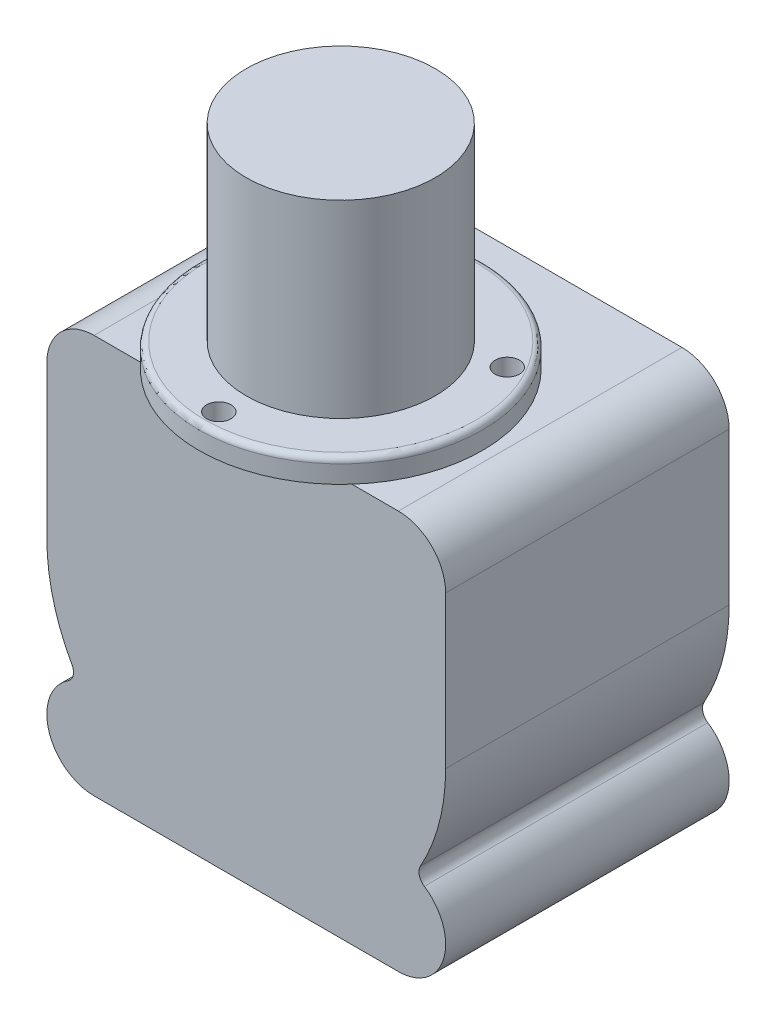
ISO-10303-21;
HEADER;
FILE_DESCRIPTION(('STEP AP214'),'2;1');
FILE_NAME('part.step','',(''),(''),'','','');
FILE_SCHEMA(('AUTOMOTIVE_DESIGN { 1 0 10303 214 1 1 1 1 }'));
ENDSEC;
DATA;
#1=APPLICATION_CONTEXT('core data for automotive mechanical design processes');
#2=APPLICATION_PROTOCOL_DEFINITION('international standard','automotive_design',2000,#1);
#3=PRODUCT_CONTEXT('',#1,'mechanical');
#4=PRODUCT('Part','Part','',(#3));
#5=PRODUCT_RELATED_PRODUCT_CATEGORY('part','',(#4));
#6=PRODUCT_DEFINITION_FORMATION('','',#4);
#7=PRODUCT_DEFINITION_CONTEXT('part definition',#1,'design');
#8=PRODUCT_DEFINITION('design','',#6,#7);
#9=PRODUCT_DEFINITION_SHAPE('','',#8);
#10=(LENGTH_UNIT() NAMED_UNIT(*) SI_UNIT(.MILLI.,.METRE.));
#11=(NAMED_UNIT(*) PLANE_ANGLE_UNIT() SI_UNIT($,.RADIAN.));
#12=(NAMED_UNIT(*) SI_UNIT($,.STERADIAN.) SOLID_ANGLE_UNIT());
#13=UNCERTAINTY_MEASURE_WITH_UNIT(LENGTH_MEASURE(1.E-05),#10,'distance_accuracy_value','');
#14=(GEOMETRIC_REPRESENTATION_CONTEXT(3) GLOBAL_UNCERTAINTY_ASSIGNED_CONTEXT((#13)) GLOBAL_UNIT_ASSIGNED_CONTEXT((#10,
#11,#12)) REPRESENTATION_CONTEXT('',''));
#15=CARTESIAN_POINT('',(0.,0.,0.));
#16=DIRECTION('',(0.,0.,1.));
#17=DIRECTION('',(1.,0.,0.));
#18=AXIS2_PLACEMENT_3D('',#15,#16,#17);
#19=CARTESIAN_POINT('',(-14.1880941902005,23.6220000000458,17.2085));
#20=DIRECTION('',(0.,1.,0.));
#21=DIRECTION('',(0.,0.,1.));
#22=AXIS2_PLACEMENT_3D('',#19,#20,#21);
#23=CONICAL_SURFACE('',#22,1.63830000012158,1.02974425869284);
#24=CARTESIAN_POINT('',(-14.1880941902173,22.637610047866,17.2085));
#25=VERTEX_POINT('',#24);
#26=VERTEX_LOOP('',#25);
#27=FACE_BOUND('',#26,.T.);
#28=CARTESIAN_POINT('',(-14.1880941902005,23.622,17.2085));
#29=DIRECTION('',(0.,1.,0.));
#30=DIRECTION('',(0.,0.,1.));
#31=AXIS2_PLACEMENT_3D('',#28,#29,#30);
#32=CIRCLE('',#31,1.6383);
#33=CARTESIAN_POINT('',(-14.1880941902005,23.622,18.8468));
#34=VERTEX_POINT('',#33);
#35=EDGE_CURVE('E189',#34,#34,#32,.T.);
#36=ORIENTED_EDGE('',*,*,#35,.T.);
#37=EDGE_LOOP('',(#36));
#38=FACE_BOUND('',#37,.T.);
#39=ADVANCED_FACE('F17',(#27,#38),#23,.F.);
#40=CARTESIAN_POINT('',(14.1880941902005,23.6220000000458,17.2085));
#41=DIRECTION('',(0.,1.,0.));
#42=DIRECTION('',(0.,0.,1.));
#43=AXIS2_PLACEMENT_3D('',#40,#41,#42);
#44=CONICAL_SURFACE('',#43,1.63829999998452,1.02974425864961);
#45=CARTESIAN_POINT('',(14.1880941901604,22.637610047866,17.2085));
#46=VERTEX_POINT('',#45);
#47=VERTEX_LOOP('',#46);
#48=FACE_BOUND('',#47,.T.);
#49=CARTESIAN_POINT('',(14.1880941902005,23.622,17.2085));
#50=DIRECTION('',(0.,1.,0.));
#51=DIRECTION('',(0.,0.,1.));
#52=AXIS2_PLACEMENT_3D('',#49,#50,#51);
#53=CIRCLE('',#52,1.6383);
#54=CARTESIAN_POINT('',(14.1880941902005,23.622,18.8468));
#55=VERTEX_POINT('',#54);
#56=EDGE_CURVE('E181',#55,#55,#53,.T.);
#57=ORIENTED_EDGE('',*,*,#56,.T.);
#58=EDGE_LOOP('',(#57));
#59=FACE_BOUND('',#58,.T.);
#60=ADVANCED_FACE('F264',(#48,#59),#44,.F.);
#61=CARTESIAN_POINT('',(0.,55.372,25.4));
#62=DIRECTION('',(0.,-1.,0.));
#63=DIRECTION('',(0.,0.,-1.));
#64=AXIS2_PLACEMENT_3D('',#61,#62,#63);
#65=PLANE('',#64);
#66=CARTESIAN_POINT('',(0.,55.372,25.4));
#67=DIRECTION('',(0.,1.,0.));
#68=DIRECTION('',(0.,0.,1.));
#69=AXIS2_PLACEMENT_3D('',#66,#67,#68);
#70=CIRCLE('',#69,12.7);
#71=CARTESIAN_POINT('',(0.,55.372,38.1));
#72=VERTEX_POINT('',#71);
#73=EDGE_CURVE('E20',#72,#72,#70,.F.);
#74=ORIENTED_EDGE('',*,*,#73,.F.);
#75=EDGE_LOOP('',(#74));
#76=FACE_BOUND('',#75,.T.);
#77=ADVANCED_FACE('F261',(#76),#65,.F.);
#78=CARTESIAN_POINT('',(-14.1880941902005,26.797,17.2085));
#79=DIRECTION('',(0.,1.,0.));
#80=DIRECTION('',(0.,0.,1.));
#81=AXIS2_PLACEMENT_3D('',#78,#79,#80);
#82=CYLINDRICAL_SURFACE('',#81,1.6383);
#83=ORIENTED_EDGE('',*,*,#35,.F.);
#84=EDGE_LOOP('',(#83));
#85=FACE_BOUND('',#84,.T.);
#86=CARTESIAN_POINT('',(-14.1880941902005,29.972,17.2085));
#87=DIRECTION('',(0.,1.,0.));
#88=DIRECTION('',(0.,0.,1.));
#89=AXIS2_PLACEMENT_3D('',#86,#87,#88);
#90=CIRCLE('',#89,1.6383);
#91=CARTESIAN_POINT('',(-14.1880941902005,29.972,18.8468));
#92=VERTEX_POINT('',#91);
#93=EDGE_CURVE('E252',#92,#92,#90,.T.);
#94=ORIENTED_EDGE('',*,*,#93,.T.);
#95=EDGE_LOOP('',(#94));
#96=FACE_BOUND('',#95,.T.);
#97=ADVANCED_FACE('F263',(#85,#96),#82,.F.);
#98=CARTESIAN_POINT('',(14.1880941902005,26.797,17.2085));
#99=DIRECTION('',(0.,1.,0.));
#100=DIRECTION('',(0.,0.,1.));
#101=AXIS2_PLACEMENT_3D('',#98,#99,#100);
#102=CYLINDRICAL_SURFACE('',#101,1.6383);
#103=ORIENTED_EDGE('',*,*,#56,.F.);
#104=EDGE_LOOP('',(#103));
#105=FACE_BOUND('',#104,.T.);
#106=CARTESIAN_POINT('',(14.1880941902005,29.972,17.2085));
#107=DIRECTION('',(0.,1.,0.));
#108=DIRECTION('',(0.,0.,1.));
#109=AXIS2_PLACEMENT_3D('',#106,#107,#108);
#110=CIRCLE('',#109,1.6383);
#111=CARTESIAN_POINT('',(14.1880941902005,29.972,18.8468));
#112=VERTEX_POINT('',#111);
#113=EDGE_CURVE('E250',#112,#112,#110,.T.);
#114=ORIENTED_EDGE('',*,*,#113,.T.);
#115=EDGE_LOOP('',(#114));
#116=FACE_BOUND('',#115,.T.);
#117=ADVANCED_FACE('F271',(#105,#116),#102,.F.);
#118=CARTESIAN_POINT('',(0.,29.972,25.4));
#119=DIRECTION('',(0.,1.,0.));
#120=DIRECTION('',(0.,0.,1.));
#121=AXIS2_PLACEMENT_3D('',#118,#119,#120);
#122=CYLINDRICAL_SURFACE('',#121,12.7);
#123=CARTESIAN_POINT('',(0.,29.972,25.4));
#124=DIRECTION('',(0.,1.,0.));
#125=DIRECTION('',(0.,0.,1.));
#126=AXIS2_PLACEMENT_3D('',#123,#124,#125);
#127=CIRCLE('',#126,12.7);
#128=CARTESIAN_POINT('',(0.,29.972,38.1));
#129=VERTEX_POINT('',#128);
#130=EDGE_CURVE('E247',#129,#129,#127,.T.);
#131=ORIENTED_EDGE('',*,*,#130,.T.);
#132=EDGE_LOOP('',(#131));
#133=FACE_BOUND('',#132,.T.);
#134=ORIENTED_EDGE('',*,*,#73,.T.);
#135=EDGE_LOOP('',(#134));
#136=FACE_BOUND('',#135,.T.);
#137=ADVANCED_FACE('F259',(#133,#136),#122,.T.);
#138=CARTESIAN_POINT('',(0.,29.972,25.4));
#139=DIRECTION('',(0.,-1.,0.));
#140=DIRECTION('',(0.,0.,-1.));
#141=AXIS2_PLACEMENT_3D('',#138,#139,#140);
#142=PLANE('',#141);
#143=ORIENTED_EDGE('',*,*,#130,.F.);
#144=EDGE_LOOP('',(#143));
#145=FACE_BOUND('',#144,.T.);
#146=CARTESIAN_POINT('',(0.,29.972,41.783));
#147=DIRECTION('',(0.,1.,0.));
#148=DIRECTION('',(0.,0.,1.));
#149=AXIS2_PLACEMENT_3D('',#146,#147,#148);
#150=CIRCLE('',#149,1.6383);
#151=CARTESIAN_POINT('',(0.,29.972,43.4213));
#152=VERTEX_POINT('',#151);
#153=EDGE_CURVE('E152',#152,#152,#150,.F.);
#154=ORIENTED_EDGE('',*,*,#153,.T.);
#155=EDGE_LOOP('',(#154));
#156=FACE_BOUND('',#155,.T.);
#157=ORIENTED_EDGE('',*,*,#113,.F.);
#158=EDGE_LOOP('',(#157));
#159=FACE_BOUND('',#158,.T.);
#160=ORIENTED_EDGE('',*,*,#93,.F.);
#161=EDGE_LOOP('',(#160));
#162=FACE_BOUND('',#161,.T.);
#163=CARTESIAN_POINT('',(0.,29.972,25.4));
#164=DIRECTION('',(0.,-1.,0.));
#165=DIRECTION('',(1.,0.,0.));
#166=AXIS2_PLACEMENT_3D('',#163,#164,#165);
#167=CIRCLE('',#166,18.25625);
#168=CARTESIAN_POINT('',(18.25625,29.972,25.4));
#169=VERTEX_POINT('',#168);
#170=EDGE_CURVE('E246',#169,#169,#167,.T.);
#171=ORIENTED_EDGE('',*,*,#170,.F.);
#172=EDGE_LOOP('',(#171));
#173=FACE_BOUND('',#172,.T.);
#174=ADVANCED_FACE('F170',(#145,#156,#159,#162,#173),#142,.F.);
#175=CARTESIAN_POINT('',(0.,29.17825,25.4));
#176=DIRECTION('',(0.,-1.,0.));
#177=DIRECTION('',(0.,0.,-1.));
#178=AXIS2_PLACEMENT_3D('',#175,#176,#177);
#179=TOROIDAL_SURFACE('',#178,18.25625,0.79375);
#180=CARTESIAN_POINT('',(0.,29.17825,25.4));
#181=DIRECTION('',(0.,1.,0.));
#182=DIRECTION('',(0.,0.,1.));
#183=AXIS2_PLACEMENT_3D('',#180,#181,#182);
#184=CIRCLE('',#183,19.05);
#185=CARTESIAN_POINT('',(0.,29.17825,44.45));
#186=VERTEX_POINT('',#185);
#187=EDGE_CURVE('E123',#186,#186,#184,.F.);
#188=ORIENTED_EDGE('',*,*,#187,.F.);
#189=EDGE_LOOP('',(#188));
#190=FACE_BOUND('',#189,.T.);
#191=ORIENTED_EDGE('',*,*,#170,.T.);
#192=EDGE_LOOP('',(#191));
#193=FACE_BOUND('',#192,.T.);
#194=ADVANCED_FACE('F164',(#190,#193),#179,.T.);
#195=CARTESIAN_POINT('',(0.,26.797,41.783));
#196=DIRECTION('',(0.,1.,0.));
#197=DIRECTION('',(0.,0.,1.));
#198=AXIS2_PLACEMENT_3D('',#195,#196,#197);
#199=CYLINDRICAL_SURFACE('',#198,1.6383);
#200=ORIENTED_EDGE('',*,*,#153,.F.);
#201=EDGE_LOOP('',(#200));
#202=FACE_BOUND('',#201,.T.);
#203=CARTESIAN_POINT('',(0.,26.797,41.783));
#204=DIRECTION('',(0.,1.,0.));
#205=DIRECTION('',(0.,0.,1.));
#206=AXIS2_PLACEMENT_3D('',#203,#204,#205);
#207=CIRCLE('',#206,1.6383);
#208=CARTESIAN_POINT('',(0.,26.797,43.4213));
#209=VERTEX_POINT('',#208);
#210=EDGE_CURVE('E232',#209,#209,#207,.T.);
#211=ORIENTED_EDGE('',*,*,#210,.F.);
#212=EDGE_LOOP('',(#211));
#213=FACE_BOUND('',#212,.T.);
#214=ADVANCED_FACE('F169',(#202,#213),#199,.F.);
#215=CARTESIAN_POINT('',(0.,26.797,25.4));
#216=DIRECTION('',(0.,1.,0.));
#217=DIRECTION('',(0.,0.,1.));
#218=AXIS2_PLACEMENT_3D('',#215,#216,#217);
#219=CYLINDRICAL_SURFACE('',#218,19.05);
#220=ORIENTED_EDGE('',*,*,#187,.T.);
#221=EDGE_LOOP('',(#220));
#222=FACE_BOUND('',#221,.T.);
#223=CARTESIAN_POINT('',(0.,26.797,25.4));
#224=DIRECTION('',(0.,1.,0.));
#225=DIRECTION('',(0.,0.,1.));
#226=AXIS2_PLACEMENT_3D('',#223,#224,#225);
#227=CIRCLE('',#226,19.05);
#228=CARTESIAN_POINT('',(-14.1990316571237,26.797,38.1));
#229=VERTEX_POINT('',#228);
#230=CARTESIAN_POINT('',(14.1990316571237,26.797,38.1));
#231=VERTEX_POINT('',#230);
#232=EDGE_CURVE('E229',#229,#231,#227,.F.);
#233=ORIENTED_EDGE('',*,*,#232,.F.);
#234=CARTESIAN_POINT('',(0.,26.797,25.4));
#235=DIRECTION('',(0.,1.,0.));
#236=DIRECTION('',(0.,0.,1.));
#237=AXIS2_PLACEMENT_3D('',#234,#235,#236);
#238=CIRCLE('',#237,19.05);
#239=EDGE_CURVE('E235',#231,#229,#238,.F.);
#240=ORIENTED_EDGE('',*,*,#239,.F.);
#241=EDGE_LOOP('',(#233,#240));
#242=FACE_BOUND('',#241,.T.);
#243=ADVANCED_FACE('F330',(#222,#242),#219,.T.);
#244=CARTESIAN_POINT('',(0.,0.,0.));
#245=DIRECTION('',(0.,0.,1.));
#246=DIRECTION('',(1.,0.,0.));
#247=AXIS2_PLACEMENT_3D('',#244,#245,#246);
#248=PLANE('',#247);
#249=DIRECTION('',(1.,0.,0.));
#250=VECTOR('',#249,1.);
#251=CARTESIAN_POINT('',(26.797,-26.797,0.));
#252=LINE('',#251,#250);
#253=CARTESIAN_POINT('',(-20.447,-26.797,0.));
#254=VERTEX_POINT('',#253);
#255=CARTESIAN_POINT('',(20.447,-26.797,0.));
#256=VERTEX_POINT('',#255);
#257=EDGE_CURVE('E118',#254,#256,#252,.T.);
#258=ORIENTED_EDGE('',*,*,#257,.F.);
#259=CARTESIAN_POINT('',(-20.447,-20.447,0.));
#260=DIRECTION('',(0.,0.,-1.));
#261=DIRECTION('',(-1.,0.,0.));
#262=AXIS2_PLACEMENT_3D('',#259,#260,#261);
#263=CIRCLE('',#262,6.35);
#264=CARTESIAN_POINT('',(-23.9286348770227,-15.1365651229773,0.));
#265=VERTEX_POINT('',#264);
#266=EDGE_CURVE('E131',#265,#254,#263,.F.);
#267=ORIENTED_EDGE('',*,*,#266,.F.);
#268=CARTESIAN_POINT('',(-24.7990435962784,-13.8089564037216,0.));
#269=DIRECTION('',(0.,0.,-1.));
#270=DIRECTION('',(-1.,0.,0.));
#271=AXIS2_PLACEMENT_3D('',#268,#269,#270);
#272=CIRCLE('',#271,1.5875);
#273=CARTESIAN_POINT('',(-23.4120724779183,-13.0366434057506,0.));
#274=VERTEX_POINT('',#273);
#275=EDGE_CURVE('E221',#265,#274,#272,.F.);
#276=ORIENTED_EDGE('',*,*,#275,.T.);
#277=CARTESIAN_POINT('',(0.,0.,0.));
#278=DIRECTION('',(0.,0.,-1.));
#279=DIRECTION('',(-1.,0.,0.));
#280=AXIS2_PLACEMENT_3D('',#277,#278,#279);
#281=CIRCLE('',#280,26.797);
#282=CARTESIAN_POINT('',(-26.797,0.,0.));
#283=VERTEX_POINT('',#282);
#284=EDGE_CURVE('E224',#283,#274,#281,.F.);
#285=ORIENTED_EDGE('',*,*,#284,.F.);
#286=DIRECTION('',(0.,1.,0.));
#287=VECTOR('',#286,1.);
#288=CARTESIAN_POINT('',(-26.797,-26.797,0.));
#289=LINE('',#288,#287);
#290=CARTESIAN_POINT('',(-26.797,20.447,0.));
#291=VERTEX_POINT('',#290);
#292=EDGE_CURVE('E142',#291,#283,#289,.F.);
#293=ORIENTED_EDGE('',*,*,#292,.F.);
#294=CARTESIAN_POINT('',(-20.447,20.447,0.));
#295=DIRECTION('',(0.,0.,1.));
#296=DIRECTION('',(1.,0.,0.));
#297=AXIS2_PLACEMENT_3D('',#294,#295,#296);
#298=CIRCLE('',#297,6.35);
#299=CARTESIAN_POINT('',(-20.447,26.797,0.));
#300=VERTEX_POINT('',#299);
#301=EDGE_CURVE('E227',#300,#291,#298,.T.);
#302=ORIENTED_EDGE('',*,*,#301,.F.);
#303=DIRECTION('',(1.,0.,0.));
#304=VECTOR('',#303,1.);
#305=CARTESIAN_POINT('',(-26.797,26.797,0.));
#306=LINE('',#305,#304);
#307=CARTESIAN_POINT('',(20.447,26.797,0.));
#308=VERTEX_POINT('',#307);
#309=EDGE_CURVE('E146',#308,#300,#306,.F.);
#310=ORIENTED_EDGE('',*,*,#309,.F.);
#311=CARTESIAN_POINT('',(20.447,20.447,0.));
#312=DIRECTION('',(0.,0.,1.));
#313=DIRECTION('',(1.,0.,0.));
#314=AXIS2_PLACEMENT_3D('',#311,#312,#313);
#315=CIRCLE('',#314,6.35);
#316=CARTESIAN_POINT('',(26.797,20.447,0.));
#317=VERTEX_POINT('',#316);
#318=EDGE_CURVE('E238',#317,#308,#315,.T.);
#319=ORIENTED_EDGE('',*,*,#318,.F.);
#320=DIRECTION('',(0.,1.,0.));
#321=VECTOR('',#320,1.);
#322=CARTESIAN_POINT('',(26.797,26.797,0.));
#323=LINE('',#322,#321);
#324=CARTESIAN_POINT('',(26.797,0.,0.));
#325=VERTEX_POINT('',#324);
#326=EDGE_CURVE('E155',#325,#317,#323,.T.);
#327=ORIENTED_EDGE('',*,*,#326,.F.);
#328=CARTESIAN_POINT('',(0.,0.,0.));
#329=DIRECTION('',(0.,0.,-1.));
#330=DIRECTION('',(-1.,0.,0.));
#331=AXIS2_PLACEMENT_3D('',#328,#329,#330);
#332=CIRCLE('',#331,26.797);
#333=CARTESIAN_POINT('',(23.4120724779183,-13.0366434057506,0.));
#334=VERTEX_POINT('',#333);
#335=EDGE_CURVE('E240',#334,#325,#332,.F.);
#336=ORIENTED_EDGE('',*,*,#335,.F.);
#337=CARTESIAN_POINT('',(24.7990435962784,-13.8089564037216,0.));
#338=DIRECTION('',(0.,0.,-1.));
#339=DIRECTION('',(-1.,0.,0.));
#340=AXIS2_PLACEMENT_3D('',#337,#338,#339);
#341=CIRCLE('',#340,1.5875);
#342=CARTESIAN_POINT('',(23.9286348770227,-15.1365651229773,0.));
#343=VERTEX_POINT('',#342);
#344=EDGE_CURVE('E120',#334,#343,#341,.F.);
#345=ORIENTED_EDGE('',*,*,#344,.T.);
#346=CARTESIAN_POINT('',(20.447,-20.447,0.));
#347=DIRECTION('',(0.,0.,-1.));
#348=DIRECTION('',(-1.,0.,0.));
#349=AXIS2_PLACEMENT_3D('',#346,#347,#348);
#350=CIRCLE('',#349,6.35);
#351=EDGE_CURVE('E113',#256,#343,#350,.F.);
#352=ORIENTED_EDGE('',*,*,#351,.F.);
#353=EDGE_LOOP('',(#258,#267,#276,#285,#293,#302,#310,#319,#327,#336,#345,#352));
#354=FACE_BOUND('',#353,.T.);
#355=ADVANCED_FACE('F115',(#354),#248,.F.);
#356=CARTESIAN_POINT('',(20.447,-20.447,38.1));
#357=DIRECTION('',(0.,0.,-1.));
#358=DIRECTION('',(-1.,0.,0.));
#359=AXIS2_PLACEMENT_3D('',#356,#357,#358);
#360=CYLINDRICAL_SURFACE('',#359,6.35);
#361=DIRECTION('',(0.,0.,-1.));
#362=VECTOR('',#361,1.);
#363=CARTESIAN_POINT('',(20.447,-26.797,0.));
#364=LINE('',#363,#362);
#365=CARTESIAN_POINT('',(20.447,-26.797,38.1));
#366=VERTEX_POINT('',#365);
#367=EDGE_CURVE('E126',#256,#366,#364,.F.);
#368=ORIENTED_EDGE('',*,*,#367,.F.);
#369=ORIENTED_EDGE('',*,*,#351,.T.);
#370=DIRECTION('',(0.,0.,-1.));
#371=VECTOR('',#370,1.);
#372=CARTESIAN_POINT('',(23.9286348770227,-15.1365651229773,38.1));
#373=LINE('',#372,#371);
#374=CARTESIAN_POINT('',(23.9286348770227,-15.1365651229773,38.1));
#375=VERTEX_POINT('',#374);
#376=EDGE_CURVE('E140',#343,#375,#373,.F.);
#377=ORIENTED_EDGE('',*,*,#376,.T.);
#378=CARTESIAN_POINT('',(20.447,-20.447,38.1));
#379=DIRECTION('',(0.,0.,-1.));
#380=DIRECTION('',(-1.,0.,0.));
#381=AXIS2_PLACEMENT_3D('',#378,#379,#380);
#382=CIRCLE('',#381,6.35);
#383=EDGE_CURVE('E129',#366,#375,#382,.F.);
#384=ORIENTED_EDGE('',*,*,#383,.F.);
#385=EDGE_LOOP('',(#368,#369,#377,#384));
#386=FACE_BOUND('',#385,.T.);
#387=ADVANCED_FACE('F127',(#386),#360,.T.);
#388=CARTESIAN_POINT('',(24.7990435962784,-13.8089564037216,38.1));
#389=DIRECTION('',(0.,0.,-1.));
#390=DIRECTION('',(-1.,0.,0.));
#391=AXIS2_PLACEMENT_3D('',#388,#389,#390);
#392=CYLINDRICAL_SURFACE('',#391,1.5875);
#393=ORIENTED_EDGE('',*,*,#376,.F.);
#394=ORIENTED_EDGE('',*,*,#344,.F.);
#395=DIRECTION('',(0.,0.,-1.));
#396=VECTOR('',#395,1.);
#397=CARTESIAN_POINT('',(23.4120724779183,-13.0366434057506,38.1));
#398=LINE('',#397,#396);
#399=CARTESIAN_POINT('',(23.4120724779183,-13.0366434057506,38.1));
#400=VERTEX_POINT('',#399);
#401=EDGE_CURVE('E242',#400,#334,#398,.T.);
#402=ORIENTED_EDGE('',*,*,#401,.F.);
#403=CARTESIAN_POINT('',(24.7990435962784,-13.8089564037216,38.1));
#404=DIRECTION('',(0.,0.,-1.));
#405=DIRECTION('',(-1.,0.,0.));
#406=AXIS2_PLACEMENT_3D('',#403,#404,#405);
#407=CIRCLE('',#406,1.5875);
#408=EDGE_CURVE('E135',#375,#400,#407,.T.);
#409=ORIENTED_EDGE('',*,*,#408,.F.);
#410=EDGE_LOOP('',(#393,#394,#402,#409));
#411=FACE_BOUND('',#410,.T.);
#412=ADVANCED_FACE('F322',(#411),#392,.F.);
#413=CARTESIAN_POINT('',(0.,0.,38.1));
#414=DIRECTION('',(0.,0.,-1.));
#415=DIRECTION('',(-1.,0.,0.));
#416=AXIS2_PLACEMENT_3D('',#413,#414,#415);
#417=CYLINDRICAL_SURFACE('',#416,26.797);
#418=DIRECTION('',(0.,0.,-1.));
#419=VECTOR('',#418,1.);
#420=CARTESIAN_POINT('',(26.797,0.,0.));
#421=LINE('',#420,#419);
#422=CARTESIAN_POINT('',(26.797,0.,38.1));
#423=VERTEX_POINT('',#422);
#424=EDGE_CURVE('E158',#423,#325,#421,.T.);
#425=ORIENTED_EDGE('',*,*,#424,.F.);
#426=CARTESIAN_POINT('',(0.,0.,38.1));
#427=DIRECTION('',(0.,0.,-1.));
#428=DIRECTION('',(-1.,0.,0.));
#429=AXIS2_PLACEMENT_3D('',#426,#427,#428);
#430=CIRCLE('',#429,26.797);
#431=EDGE_CURVE('E214',#400,#423,#430,.F.);
#432=ORIENTED_EDGE('',*,*,#431,.F.);
#433=ORIENTED_EDGE('',*,*,#401,.T.);
#434=ORIENTED_EDGE('',*,*,#335,.T.);
#435=EDGE_LOOP('',(#425,#432,#433,#434));
#436=FACE_BOUND('',#435,.T.);
#437=ADVANCED_FACE('F318',(#436),#417,.T.);
#438=CARTESIAN_POINT('',(26.797,26.797,0.));
#439=DIRECTION('',(1.,0.,0.));
#440=DIRECTION('',(0.,0.,-1.));
#441=AXIS2_PLACEMENT_3D('',#438,#439,#440);
#442=PLANE('',#441);
#443=DIRECTION('',(0.,0.,1.));
#444=VECTOR('',#443,1.);
#445=CARTESIAN_POINT('',(26.797,20.447,0.));
#446=LINE('',#445,#444);
#447=CARTESIAN_POINT('',(26.797,20.447,38.1));
#448=VERTEX_POINT('',#447);
#449=EDGE_CURVE('E157',#448,#317,#446,.F.);
#450=ORIENTED_EDGE('',*,*,#449,.F.);
#451=DIRECTION('',(0.,1.,0.));
#452=VECTOR('',#451,1.);
#453=CARTESIAN_POINT('',(26.797,0.,38.1));
#454=LINE('',#453,#452);
#455=EDGE_CURVE('E213',#423,#448,#454,.T.);
#456=ORIENTED_EDGE('',*,*,#455,.F.);
#457=ORIENTED_EDGE('',*,*,#424,.T.);
#458=ORIENTED_EDGE('',*,*,#326,.T.);
#459=EDGE_LOOP('',(#450,#456,#457,#458));
#460=FACE_BOUND('',#459,.T.);
#461=ADVANCED_FACE('F314',(#460),#442,.T.);
#462=CARTESIAN_POINT('',(20.447,20.447,0.));
#463=DIRECTION('',(0.,0.,1.));
#464=DIRECTION('',(1.,0.,0.));
#465=AXIS2_PLACEMENT_3D('',#462,#463,#464);
#466=CYLINDRICAL_SURFACE('',#465,6.35);
#467=ORIENTED_EDGE('',*,*,#318,.T.);
#468=DIRECTION('',(0.,0.,1.));
#469=VECTOR('',#468,1.);
#470=CARTESIAN_POINT('',(20.447,26.797,0.));
#471=LINE('',#470,#469);
#472=CARTESIAN_POINT('',(20.447,26.797,38.1));
#473=VERTEX_POINT('',#472);
#474=EDGE_CURVE('E149',#473,#308,#471,.F.);
#475=ORIENTED_EDGE('',*,*,#474,.F.);
#476=CARTESIAN_POINT('',(20.447,20.447,38.1));
#477=DIRECTION('',(0.,0.,1.));
#478=DIRECTION('',(1.,0.,0.));
#479=AXIS2_PLACEMENT_3D('',#476,#477,#478);
#480=CIRCLE('',#479,6.35);
#481=EDGE_CURVE('E209',#448,#473,#480,.T.);
#482=ORIENTED_EDGE('',*,*,#481,.F.);
#483=ORIENTED_EDGE('',*,*,#449,.T.);
#484=EDGE_LOOP('',(#467,#475,#482,#483));
#485=FACE_BOUND('',#484,.T.);
#486=ADVANCED_FACE('F310',(#485),#466,.T.);
#487=CARTESIAN_POINT('',(0.,26.797,25.4));
#488=DIRECTION('',(0.,-1.,0.));
#489=DIRECTION('',(0.,0.,-1.));
#490=AXIS2_PLACEMENT_3D('',#487,#488,#489);
#491=PLANE('',#490);
#492=ORIENTED_EDGE('',*,*,#210,.T.);
#493=EDGE_LOOP('',(#492));
#494=FACE_BOUND('',#493,.T.);
#495=DIRECTION('',(1.,0.,0.));
#496=VECTOR('',#495,1.);
#497=CARTESIAN_POINT('',(0.,26.797,38.1));
#498=LINE('',#497,#496);
#499=EDGE_CURVE('E344',#231,#229,#498,.F.);
#500=ORIENTED_EDGE('',*,*,#499,.F.);
#501=ORIENTED_EDGE('',*,*,#239,.T.);
#502=EDGE_LOOP('',(#500,#501));
#503=FACE_BOUND('',#502,.T.);
#504=ADVANCED_FACE('F306',(#494,#503),#491,.T.);
#505=CARTESIAN_POINT('',(-26.797,26.797,0.));
#506=DIRECTION('',(0.,1.,0.));
#507=DIRECTION('',(0.,0.,1.));
#508=AXIS2_PLACEMENT_3D('',#505,#506,#507);
#509=PLANE('',#508);
#510=DIRECTION('',(0.,0.,1.));
#511=VECTOR('',#510,1.);
#512=CARTESIAN_POINT('',(-20.447,26.797,0.));
#513=LINE('',#512,#511);
#514=CARTESIAN_POINT('',(-20.447,26.797,38.1));
#515=VERTEX_POINT('',#514);
#516=EDGE_CURVE('E148',#515,#300,#513,.F.);
#517=ORIENTED_EDGE('',*,*,#516,.F.);
#518=DIRECTION('',(1.,0.,0.));
#519=VECTOR('',#518,1.);
#520=CARTESIAN_POINT('',(0.,26.797,38.1));
#521=LINE('',#520,#519);
#522=EDGE_CURVE('E208',#229,#515,#521,.F.);
#523=ORIENTED_EDGE('',*,*,#522,.F.);
#524=ORIENTED_EDGE('',*,*,#232,.T.);
#525=DIRECTION('',(1.,0.,0.));
#526=VECTOR('',#525,1.);
#527=CARTESIAN_POINT('',(0.,26.797,38.1));
#528=LINE('',#527,#526);
#529=EDGE_CURVE('E212',#473,#231,#528,.F.);
#530=ORIENTED_EDGE('',*,*,#529,.F.);
#531=ORIENTED_EDGE('',*,*,#474,.T.);
#532=ORIENTED_EDGE('',*,*,#309,.T.);
#533=EDGE_LOOP('',(#517,#523,#524,#530,#531,#532));
#534=FACE_BOUND('',#533,.T.);
#535=ADVANCED_FACE('F302',(#534),#509,.T.);
#536=CARTESIAN_POINT('',(-20.447,20.447,0.));
#537=DIRECTION('',(0.,0.,1.));
#538=DIRECTION('',(1.,0.,0.));
#539=AXIS2_PLACEMENT_3D('',#536,#537,#538);
#540=CYLINDRICAL_SURFACE('',#539,6.35);
#541=ORIENTED_EDGE('',*,*,#301,.T.);
#542=DIRECTION('',(0.,0.,1.));
#543=VECTOR('',#542,1.);
#544=CARTESIAN_POINT('',(-26.797,20.447,0.));
#545=LINE('',#544,#543);
#546=CARTESIAN_POINT('',(-26.797,20.447,38.1));
#547=VERTEX_POINT('',#546);
#548=EDGE_CURVE('E145',#547,#291,#545,.F.);
#549=ORIENTED_EDGE('',*,*,#548,.F.);
#550=CARTESIAN_POINT('',(-20.447,20.447,38.1));
#551=DIRECTION('',(0.,0.,1.));
#552=DIRECTION('',(1.,0.,0.));
#553=AXIS2_PLACEMENT_3D('',#550,#551,#552);
#554=CIRCLE('',#553,6.35);
#555=EDGE_CURVE('E205',#515,#547,#554,.T.);
#556=ORIENTED_EDGE('',*,*,#555,.F.);
#557=ORIENTED_EDGE('',*,*,#516,.T.);
#558=EDGE_LOOP('',(#541,#549,#556,#557));
#559=FACE_BOUND('',#558,.T.);
#560=ADVANCED_FACE('F298',(#559),#540,.T.);
#561=CARTESIAN_POINT('',(-26.797,-26.797,0.));
#562=DIRECTION('',(-1.,0.,0.));
#563=DIRECTION('',(0.,0.,1.));
#564=AXIS2_PLACEMENT_3D('',#561,#562,#563);
#565=PLANE('',#564);
#566=ORIENTED_EDGE('',*,*,#548,.T.);
#567=ORIENTED_EDGE('',*,*,#292,.T.);
#568=DIRECTION('',(0.,0.,-1.));
#569=VECTOR('',#568,1.);
#570=CARTESIAN_POINT('',(-26.797,0.,38.1));
#571=LINE('',#570,#569);
#572=CARTESIAN_POINT('',(-26.797,0.,38.1));
#573=VERTEX_POINT('',#572);
#574=EDGE_CURVE('E144',#573,#283,#571,.T.);
#575=ORIENTED_EDGE('',*,*,#574,.F.);
#576=DIRECTION('',(0.,1.,0.));
#577=VECTOR('',#576,1.);
#578=CARTESIAN_POINT('',(-26.797,0.,38.1));
#579=LINE('',#578,#577);
#580=EDGE_CURVE('E204',#547,#573,#579,.F.);
#581=ORIENTED_EDGE('',*,*,#580,.F.);
#582=EDGE_LOOP('',(#566,#567,#575,#581));
#583=FACE_BOUND('',#582,.T.);
#584=ADVANCED_FACE('F294',(#583),#565,.T.);
#585=CARTESIAN_POINT('',(0.,0.,38.1));
#586=DIRECTION('',(0.,0.,-1.));
#587=DIRECTION('',(-1.,0.,0.));
#588=AXIS2_PLACEMENT_3D('',#585,#586,#587);
#589=CYLINDRICAL_SURFACE('',#588,26.797);
#590=ORIENTED_EDGE('',*,*,#574,.T.);
#591=ORIENTED_EDGE('',*,*,#284,.T.);
#592=DIRECTION('',(0.,0.,-1.));
#593=VECTOR('',#592,1.);
#594=CARTESIAN_POINT('',(-23.4120724779183,-13.0366434057506,38.1));
#595=LINE('',#594,#593);
#596=CARTESIAN_POINT('',(-23.4120724779183,-13.0366434057506,38.1));
#597=VERTEX_POINT('',#596);
#598=EDGE_CURVE('E223',#274,#597,#595,.F.);
#599=ORIENTED_EDGE('',*,*,#598,.T.);
#600=CARTESIAN_POINT('',(0.,0.,38.1));
#601=DIRECTION('',(0.,0.,-1.));
#602=DIRECTION('',(-1.,0.,0.));
#603=AXIS2_PLACEMENT_3D('',#600,#601,#602);
#604=CIRCLE('',#603,26.797);
#605=EDGE_CURVE('E201',#573,#597,#604,.F.);
#606=ORIENTED_EDGE('',*,*,#605,.F.);
#607=EDGE_LOOP('',(#590,#591,#599,#606));
#608=FACE_BOUND('',#607,.T.);
#609=ADVANCED_FACE('F290',(#608),#589,.T.);
#610=CARTESIAN_POINT('',(-24.7990435962784,-13.8089564037216,38.1));
#611=DIRECTION('',(0.,0.,-1.));
#612=DIRECTION('',(-1.,0.,0.));
#613=AXIS2_PLACEMENT_3D('',#610,#611,#612);
#614=CYLINDRICAL_SURFACE('',#613,1.5875);
#615=ORIENTED_EDGE('',*,*,#598,.F.);
#616=ORIENTED_EDGE('',*,*,#275,.F.);
#617=DIRECTION('',(0.,0.,-1.));
#618=VECTOR('',#617,1.);
#619=CARTESIAN_POINT('',(-23.9286348770227,-15.1365651229773,38.1));
#620=LINE('',#619,#618);
#621=CARTESIAN_POINT('',(-23.9286348770227,-15.1365651229773,38.1));
#622=VERTEX_POINT('',#621);
#623=EDGE_CURVE('E220',#622,#265,#620,.T.);
#624=ORIENTED_EDGE('',*,*,#623,.F.);
#625=CARTESIAN_POINT('',(-24.7990435962784,-13.8089564037216,38.1));
#626=DIRECTION('',(0.,0.,-1.));
#627=DIRECTION('',(-1.,0.,0.));
#628=AXIS2_PLACEMENT_3D('',#625,#626,#627);
#629=CIRCLE('',#628,1.5875);
#630=EDGE_CURVE('E198',#597,#622,#629,.T.);
#631=ORIENTED_EDGE('',*,*,#630,.F.);
#632=EDGE_LOOP('',(#615,#616,#624,#631));
#633=FACE_BOUND('',#632,.T.);
#634=ADVANCED_FACE('F287',(#633),#614,.F.);
#635=CARTESIAN_POINT('',(-20.447,-20.447,38.1));
#636=DIRECTION('',(0.,0.,-1.));
#637=DIRECTION('',(-1.,0.,0.));
#638=AXIS2_PLACEMENT_3D('',#635,#636,#637);
#639=CYLINDRICAL_SURFACE('',#638,6.35);
#640=DIRECTION('',(0.,0.,-1.));
#641=VECTOR('',#640,1.);
#642=CARTESIAN_POINT('',(-20.447,-26.797,0.));
#643=LINE('',#642,#641);
#644=CARTESIAN_POINT('',(-20.447,-26.797,38.1));
#645=VERTEX_POINT('',#644);
#646=EDGE_CURVE('E35',#645,#254,#643,.T.);
#647=ORIENTED_EDGE('',*,*,#646,.F.);
#648=CARTESIAN_POINT('',(-20.447,-20.447,38.1));
#649=DIRECTION('',(0.,0.,-1.));
#650=DIRECTION('',(-1.,0.,0.));
#651=AXIS2_PLACEMENT_3D('',#648,#649,#650);
#652=CIRCLE('',#651,6.35);
#653=EDGE_CURVE('E26',#622,#645,#652,.F.);
#654=ORIENTED_EDGE('',*,*,#653,.F.);
#655=ORIENTED_EDGE('',*,*,#623,.T.);
#656=ORIENTED_EDGE('',*,*,#266,.T.);
#657=EDGE_LOOP('',(#647,#654,#655,#656));
#658=FACE_BOUND('',#657,.T.);
#659=ADVANCED_FACE('F282',(#658),#639,.T.);
#660=CARTESIAN_POINT('',(26.797,-26.797,0.));
#661=DIRECTION('',(0.,-1.,0.));
#662=DIRECTION('',(0.,0.,-1.));
#663=AXIS2_PLACEMENT_3D('',#660,#661,#662);
#664=PLANE('',#663);
#665=ORIENTED_EDGE('',*,*,#646,.T.);
#666=ORIENTED_EDGE('',*,*,#257,.T.);
#667=ORIENTED_EDGE('',*,*,#367,.T.);
#668=DIRECTION('',(1.,0.,0.));
#669=VECTOR('',#668,1.);
#670=CARTESIAN_POINT('',(0.,-26.797,38.1));
#671=LINE('',#670,#669);
#672=EDGE_CURVE('E11',#645,#366,#671,.T.);
#673=ORIENTED_EDGE('',*,*,#672,.F.);
#674=EDGE_LOOP('',(#665,#666,#667,#673));
#675=FACE_BOUND('',#674,.T.);
#676=ADVANCED_FACE('F133',(#675),#664,.T.);
#677=CARTESIAN_POINT('',(0.,0.,38.1));
#678=DIRECTION('',(0.,0.,1.));
#679=DIRECTION('',(1.,0.,0.));
#680=AXIS2_PLACEMENT_3D('',#677,#678,#679);
#681=PLANE('',#680);
#682=ORIENTED_EDGE('',*,*,#653,.T.);
#683=ORIENTED_EDGE('',*,*,#672,.T.);
#684=ORIENTED_EDGE('',*,*,#383,.T.);
#685=ORIENTED_EDGE('',*,*,#408,.T.);
#686=ORIENTED_EDGE('',*,*,#431,.T.);
#687=ORIENTED_EDGE('',*,*,#455,.T.);
#688=ORIENTED_EDGE('',*,*,#481,.T.);
#689=ORIENTED_EDGE('',*,*,#529,.T.);
#690=ORIENTED_EDGE('',*,*,#499,.T.);
#691=ORIENTED_EDGE('',*,*,#522,.T.);
#692=ORIENTED_EDGE('',*,*,#555,.T.);
#693=ORIENTED_EDGE('',*,*,#580,.T.);
#694=ORIENTED_EDGE('',*,*,#605,.T.);
#695=ORIENTED_EDGE('',*,*,#630,.T.);
#696=EDGE_LOOP('',(#682,#683,#684,#685,#686,#687,#688,#689,#690,#691,#692,#693,#694,#695));
#697=FACE_BOUND('',#696,.T.);
#698=ADVANCED_FACE('F275',(#697),#681,.T.);
#699=CLOSED_SHELL('',(#39,#60,#77,#97,#117,#137,#174,#194,#214,#243,#355,#387,#412,#437,#461,
#486,#504,#535,#560,#584,#609,#634,#659,#676,#698));
#700=MANIFOLD_SOLID_BREP('B1',#699);
#701=ADVANCED_BREP_SHAPE_REPRESENTATION('',(#18,#700),#14);
#702=SHAPE_DEFINITION_REPRESENTATION(#9,#701);
ENDSEC;
END-ISO-10303-21;
